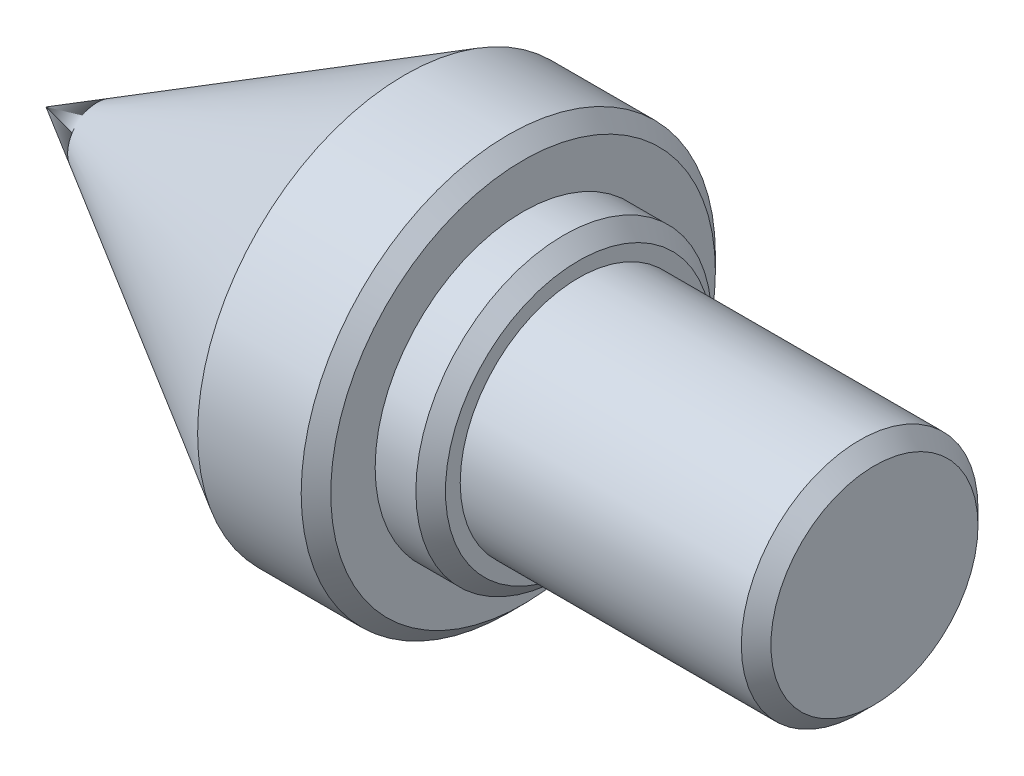
ISO-10303-21;
HEADER;
FILE_DESCRIPTION(('STEP AP214'),'2;1');
FILE_NAME('part.step','',(''),(''),'','','');
FILE_SCHEMA(('AUTOMOTIVE_DESIGN { 1 0 10303 214 1 1 1 1 }'));
ENDSEC;
DATA;
#1=APPLICATION_CONTEXT('core data for automotive mechanical design processes');
#2=APPLICATION_PROTOCOL_DEFINITION('international standard','automotive_design',2000,#1);
#3=PRODUCT_CONTEXT('',#1,'mechanical');
#4=PRODUCT('Part','Part','',(#3));
#5=PRODUCT_RELATED_PRODUCT_CATEGORY('part','',(#4));
#6=PRODUCT_DEFINITION_FORMATION('','',#4);
#7=PRODUCT_DEFINITION_CONTEXT('part definition',#1,'design');
#8=PRODUCT_DEFINITION('design','',#6,#7);
#9=PRODUCT_DEFINITION_SHAPE('','',#8);
#10=(LENGTH_UNIT() NAMED_UNIT(*) SI_UNIT(.MILLI.,.METRE.));
#11=(NAMED_UNIT(*) PLANE_ANGLE_UNIT() SI_UNIT($,.RADIAN.));
#12=(NAMED_UNIT(*) SI_UNIT($,.STERADIAN.) SOLID_ANGLE_UNIT());
#13=UNCERTAINTY_MEASURE_WITH_UNIT(LENGTH_MEASURE(1.E-05),#10,'distance_accuracy_value','');
#14=(GEOMETRIC_REPRESENTATION_CONTEXT(3) GLOBAL_UNCERTAINTY_ASSIGNED_CONTEXT((#13)) GLOBAL_UNIT_ASSIGNED_CONTEXT((#10,
#11,#12)) REPRESENTATION_CONTEXT('',''));
#15=CARTESIAN_POINT('',(0.,0.,0.));
#16=DIRECTION('',(0.,0.,1.));
#17=DIRECTION('',(1.,0.,0.));
#18=AXIS2_PLACEMENT_3D('',#15,#16,#17);
#19=CARTESIAN_POINT('',(-0.5,0.,0.));
#20=DIRECTION('',(-1.,0.,0.));
#21=DIRECTION('',(0.,0.,1.));
#22=AXIS2_PLACEMENT_3D('',#19,#20,#21);
#23=CONICAL_SURFACE('',#22,4.,0.785398163397449);
#24=CARTESIAN_POINT('',(-0.5,0.,0.));
#25=DIRECTION('',(-1.,0.,0.));
#26=DIRECTION('',(0.,0.,-1.));
#27=AXIS2_PLACEMENT_3D('',#24,#25,#26);
#28=CIRCLE('',#27,4.);
#29=CARTESIAN_POINT('',(-0.5,0.,-4.));
#30=VERTEX_POINT('',#29);
#31=EDGE_CURVE('E24',#30,#30,#28,.T.);
#32=ORIENTED_EDGE('',*,*,#31,.F.);
#33=EDGE_LOOP('',(#32));
#34=FACE_BOUND('',#33,.T.);
#35=CARTESIAN_POINT('',(0.,0.,0.));
#36=DIRECTION('',(1.,0.,0.));
#37=DIRECTION('',(0.,0.,-1.));
#38=AXIS2_PLACEMENT_3D('',#35,#36,#37);
#39=CIRCLE('',#38,3.5);
#40=CARTESIAN_POINT('',(0.,0.,-3.5));
#41=VERTEX_POINT('',#40);
#42=EDGE_CURVE('E11',#41,#41,#39,.T.);
#43=ORIENTED_EDGE('',*,*,#42,.F.);
#44=EDGE_LOOP('',(#43));
#45=FACE_BOUND('',#44,.T.);
#46=ADVANCED_FACE('F17',(#34,#45),#23,.T.);
#47=CARTESIAN_POINT('',(-10.5,0.,0.));
#48=DIRECTION('',(-1.,0.,0.));
#49=DIRECTION('',(0.,0.,1.));
#50=AXIS2_PLACEMENT_3D('',#47,#48,#49);
#51=CONICAL_SURFACE('',#50,5.,0.785398163397447);
#52=CARTESIAN_POINT('',(-10.5,0.,0.));
#53=DIRECTION('',(-1.,0.,0.));
#54=DIRECTION('',(0.,0.,-1.));
#55=AXIS2_PLACEMENT_3D('',#52,#53,#54);
#56=CIRCLE('',#55,5.);
#57=CARTESIAN_POINT('',(-10.5,0.,-5.));
#58=VERTEX_POINT('',#57);
#59=EDGE_CURVE('E52',#58,#58,#56,.T.);
#60=ORIENTED_EDGE('',*,*,#59,.F.);
#61=EDGE_LOOP('',(#60));
#62=FACE_BOUND('',#61,.T.);
#63=CARTESIAN_POINT('',(-10.,0.,0.));
#64=DIRECTION('',(1.,0.,0.));
#65=DIRECTION('',(0.,0.,-1.));
#66=AXIS2_PLACEMENT_3D('',#63,#64,#65);
#67=CIRCLE('',#66,4.5);
#68=CARTESIAN_POINT('',(-10.,0.,-4.5));
#69=VERTEX_POINT('',#68);
#70=EDGE_CURVE('E61',#69,#69,#67,.T.);
#71=ORIENTED_EDGE('',*,*,#70,.F.);
#72=EDGE_LOOP('',(#71));
#73=FACE_BOUND('',#72,.T.);
#74=ADVANCED_FACE('F78',(#62,#73),#51,.T.);
#75=CARTESIAN_POINT('',(-12.3756443470179,0.,0.));
#76=DIRECTION('',(-1.,0.,0.));
#77=DIRECTION('',(0.,0.,1.));
#78=AXIS2_PLACEMENT_3D('',#75,#76,#77);
#79=CONICAL_SURFACE('',#78,7.,0.785398163397448);
#80=CARTESIAN_POINT('',(-12.3756443470179,0.,0.));
#81=DIRECTION('',(-1.,0.,0.));
#82=DIRECTION('',(0.,0.,-1.));
#83=AXIS2_PLACEMENT_3D('',#80,#81,#82);
#84=CIRCLE('',#83,7.);
#85=CARTESIAN_POINT('',(-12.3756443470179,0.,-7.));
#86=VERTEX_POINT('',#85);
#87=EDGE_CURVE('E42',#86,#86,#84,.T.);
#88=ORIENTED_EDGE('',*,*,#87,.F.);
#89=EDGE_LOOP('',(#88));
#90=FACE_BOUND('',#89,.T.);
#91=CARTESIAN_POINT('',(-11.8756443470179,0.,0.));
#92=DIRECTION('',(1.,0.,0.));
#93=DIRECTION('',(0.,0.,-1.));
#94=AXIS2_PLACEMENT_3D('',#91,#92,#93);
#95=CIRCLE('',#94,6.5);
#96=CARTESIAN_POINT('',(-11.8756443470179,0.,-6.5));
#97=VERTEX_POINT('',#96);
#98=EDGE_CURVE('E49',#97,#97,#95,.T.);
#99=ORIENTED_EDGE('',*,*,#98,.F.);
#100=EDGE_LOOP('',(#99));
#101=FACE_BOUND('',#100,.T.);
#102=ADVANCED_FACE('F83',(#90,#101),#79,.T.);
#103=CARTESIAN_POINT('',(0.,0.,4.));
#104=DIRECTION('',(1.,0.,0.));
#105=DIRECTION('',(0.,1.,0.));
#106=AXIS2_PLACEMENT_3D('',#103,#104,#105);
#107=PLANE('',#106);
#108=ORIENTED_EDGE('',*,*,#42,.T.);
#109=EDGE_LOOP('',(#108));
#110=FACE_BOUND('',#109,.T.);
#111=ADVANCED_FACE('F81',(#110),#107,.T.);
#112=CARTESIAN_POINT('',(0.,0.,0.));
#113=DIRECTION('',(-1.,0.,0.));
#114=DIRECTION('',(0.,0.,1.));
#115=AXIS2_PLACEMENT_3D('',#112,#113,#114);
#116=CYLINDRICAL_SURFACE('',#115,4.);
#117=CARTESIAN_POINT('',(-10.,0.,0.));
#118=DIRECTION('',(-1.,0.,0.));
#119=DIRECTION('',(0.,0.,1.));
#120=AXIS2_PLACEMENT_3D('',#117,#118,#119);
#121=CIRCLE('',#120,4.);
#122=CARTESIAN_POINT('',(-10.,0.,4.));
#123=VERTEX_POINT('',#122);
#124=EDGE_CURVE('E65',#123,#123,#121,.T.);
#125=ORIENTED_EDGE('',*,*,#124,.F.);
#126=EDGE_LOOP('',(#125));
#127=FACE_BOUND('',#126,.T.);
#128=ORIENTED_EDGE('',*,*,#31,.T.);
#129=EDGE_LOOP('',(#128));
#130=FACE_BOUND('',#129,.T.);
#131=ADVANCED_FACE('F74',(#127,#130),#116,.T.);
#132=CARTESIAN_POINT('',(-10.,0.,5.));
#133=DIRECTION('',(1.,0.,0.));
#134=DIRECTION('',(0.,1.,0.));
#135=AXIS2_PLACEMENT_3D('',#132,#133,#134);
#136=PLANE('',#135);
#137=ORIENTED_EDGE('',*,*,#124,.T.);
#138=EDGE_LOOP('',(#137));
#139=FACE_BOUND('',#138,.T.);
#140=ORIENTED_EDGE('',*,*,#70,.T.);
#141=EDGE_LOOP('',(#140));
#142=FACE_BOUND('',#141,.T.);
#143=ADVANCED_FACE('F90',(#139,#142),#136,.T.);
#144=CARTESIAN_POINT('',(0.,0.,0.));
#145=DIRECTION('',(-1.,0.,0.));
#146=DIRECTION('',(0.,0.,1.));
#147=AXIS2_PLACEMENT_3D('',#144,#145,#146);
#148=CYLINDRICAL_SURFACE('',#147,5.);
#149=CARTESIAN_POINT('',(-11.8756443470179,0.,0.));
#150=DIRECTION('',(-1.,0.,0.));
#151=DIRECTION('',(0.,0.,1.));
#152=AXIS2_PLACEMENT_3D('',#149,#150,#151);
#153=CIRCLE('',#152,5.);
#154=CARTESIAN_POINT('',(-11.8756443470179,0.,5.));
#155=VERTEX_POINT('',#154);
#156=EDGE_CURVE('E57',#155,#155,#153,.T.);
#157=ORIENTED_EDGE('',*,*,#156,.F.);
#158=EDGE_LOOP('',(#157));
#159=FACE_BOUND('',#158,.T.);
#160=ORIENTED_EDGE('',*,*,#59,.T.);
#161=EDGE_LOOP('',(#160));
#162=FACE_BOUND('',#161,.T.);
#163=ADVANCED_FACE('F106',(#159,#162),#148,.T.);
#164=CARTESIAN_POINT('',(-11.8756443470179,0.,7.));
#165=DIRECTION('',(1.,0.,0.));
#166=DIRECTION('',(0.,1.,0.));
#167=AXIS2_PLACEMENT_3D('',#164,#165,#166);
#168=PLANE('',#167);
#169=ORIENTED_EDGE('',*,*,#156,.T.);
#170=EDGE_LOOP('',(#169));
#171=FACE_BOUND('',#170,.T.);
#172=ORIENTED_EDGE('',*,*,#98,.T.);
#173=EDGE_LOOP('',(#172));
#174=FACE_BOUND('',#173,.T.);
#175=ADVANCED_FACE('F111',(#171,#174),#168,.T.);
#176=CARTESIAN_POINT('',(0.,0.,0.));
#177=DIRECTION('',(-1.,0.,0.));
#178=DIRECTION('',(0.,0.,1.));
#179=AXIS2_PLACEMENT_3D('',#176,#177,#178);
#180=CYLINDRICAL_SURFACE('',#179,7.);
#181=CARTESIAN_POINT('',(-15.8756443470179,0.,0.));
#182=DIRECTION('',(-1.,0.,0.));
#183=DIRECTION('',(0.,0.,1.));
#184=AXIS2_PLACEMENT_3D('',#181,#182,#183);
#185=CIRCLE('',#184,7.);
#186=CARTESIAN_POINT('',(-15.8756443470179,0.,7.));
#187=VERTEX_POINT('',#186);
#188=EDGE_CURVE('E39',#187,#187,#185,.T.);
#189=ORIENTED_EDGE('',*,*,#188,.F.);
#190=EDGE_LOOP('',(#189));
#191=FACE_BOUND('',#190,.T.);
#192=ORIENTED_EDGE('',*,*,#87,.T.);
#193=EDGE_LOOP('',(#192));
#194=FACE_BOUND('',#193,.T.);
#195=ADVANCED_FACE('F35',(#191,#194),#180,.T.);
#196=CARTESIAN_POINT('',(-27.,0.,0.));
#197=DIRECTION('',(1.,0.,0.));
#198=DIRECTION('',(0.,0.,-1.));
#199=AXIS2_PLACEMENT_3D('',#196,#197,#198);
#200=CONICAL_SURFACE('',#199,0.577350269189626,0.523598775598299);
#201=CARTESIAN_POINT('',(-28.,0.,0.));
#202=VERTEX_POINT('',#201);
#203=VERTEX_LOOP('',#202);
#204=FACE_BOUND('',#203,.T.);
#205=ORIENTED_EDGE('',*,*,#188,.T.);
#206=EDGE_LOOP('',(#205));
#207=FACE_BOUND('',#206,.T.);
#208=ADVANCED_FACE('F32',(#204,#207),#200,.T.);
#209=CLOSED_SHELL('',(#46,#74,#102,#111,#131,#143,#163,#175,#195,#208));
#210=MANIFOLD_SOLID_BREP('B1',#209);
#211=ADVANCED_BREP_SHAPE_REPRESENTATION('',(#18,#210),#14);
#212=SHAPE_DEFINITION_REPRESENTATION(#9,#211);
ENDSEC;
END-ISO-10303-21;
